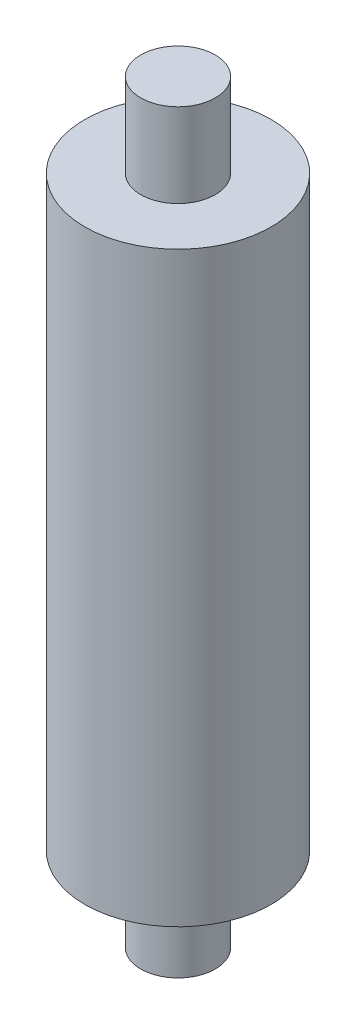
ISO-10303-21;
HEADER;
FILE_DESCRIPTION(('STEP AP214'),'2;1');
FILE_NAME('part.step','',(''),(''),'','','');
FILE_SCHEMA(('AUTOMOTIVE_DESIGN { 1 0 10303 214 1 1 1 1 }'));
ENDSEC;
DATA;
#1=APPLICATION_CONTEXT('core data for automotive mechanical design processes');
#2=APPLICATION_PROTOCOL_DEFINITION('international standard','automotive_design',2000,#1);
#3=PRODUCT_CONTEXT('',#1,'mechanical');
#4=PRODUCT('Part','Part','',(#3));
#5=PRODUCT_RELATED_PRODUCT_CATEGORY('part','',(#4));
#6=PRODUCT_DEFINITION_FORMATION('','',#4);
#7=PRODUCT_DEFINITION_CONTEXT('part definition',#1,'design');
#8=PRODUCT_DEFINITION('design','',#6,#7);
#9=PRODUCT_DEFINITION_SHAPE('','',#8);
#10=(LENGTH_UNIT() NAMED_UNIT(*) SI_UNIT(.MILLI.,.METRE.));
#11=(NAMED_UNIT(*) PLANE_ANGLE_UNIT() SI_UNIT($,.RADIAN.));
#12=(NAMED_UNIT(*) SI_UNIT($,.STERADIAN.) SOLID_ANGLE_UNIT());
#13=UNCERTAINTY_MEASURE_WITH_UNIT(LENGTH_MEASURE(1.E-05),#10,'distance_accuracy_value','');
#14=(GEOMETRIC_REPRESENTATION_CONTEXT(3) GLOBAL_UNCERTAINTY_ASSIGNED_CONTEXT((#13)) GLOBAL_UNIT_ASSIGNED_CONTEXT((#10,
#11,#12)) REPRESENTATION_CONTEXT('',''));
#15=CARTESIAN_POINT('',(0.,0.,0.));
#16=DIRECTION('',(0.,0.,1.));
#17=DIRECTION('',(1.,0.,0.));
#18=AXIS2_PLACEMENT_3D('',#15,#16,#17);
#19=CARTESIAN_POINT('',(0.,-40.5000000000002,0.));
#20=DIRECTION('',(0.,-1.,0.));
#21=DIRECTION('',(0.,0.,-1.));
#22=AXIS2_PLACEMENT_3D('',#19,#20,#21);
#23=PLANE('',#22);
#24=CARTESIAN_POINT('',(0.,-40.5000000000002,-1.38925084454874E-13));
#25=DIRECTION('',(0.,-1.,0.));
#26=DIRECTION('',(0.,0.,-1.));
#27=AXIS2_PLACEMENT_3D('',#24,#25,#26);
#28=CIRCLE('',#27,3.99999999999986);
#29=CARTESIAN_POINT('',(0.,-40.5000000000002,-4.));
#30=VERTEX_POINT('',#29);
#31=EDGE_CURVE('E10',#30,#30,#28,.T.);
#32=ORIENTED_EDGE('',*,*,#31,.T.);
#33=EDGE_LOOP('',(#32));
#34=FACE_BOUND('',#33,.T.);
#35=ADVANCED_FACE('F33',(#34),#23,.T.);
#36=CARTESIAN_POINT('',(0.,-1000.,-3.43024899888577E-12));
#37=DIRECTION('',(0.,-1.,0.));
#38=DIRECTION('',(0.,0.,-1.));
#39=AXIS2_PLACEMENT_3D('',#36,#37,#38);
#40=CYLINDRICAL_SURFACE('',#39,3.99999999999988);
#41=CARTESIAN_POINT('',(0.,-31.5000000000002,-1.08052843464902E-13));
#42=DIRECTION('',(0.,-1.,0.));
#43=DIRECTION('',(0.,0.,-1.));
#44=AXIS2_PLACEMENT_3D('',#41,#42,#43);
#45=CIRCLE('',#44,3.99999999999989);
#46=CARTESIAN_POINT('',(0.,-31.5000000000002,-4.));
#47=VERTEX_POINT('',#46);
#48=EDGE_CURVE('E39',#47,#47,#45,.T.);
#49=ORIENTED_EDGE('',*,*,#48,.T.);
#50=EDGE_LOOP('',(#49));
#51=FACE_BOUND('',#50,.T.);
#52=ORIENTED_EDGE('',*,*,#31,.F.);
#53=EDGE_LOOP('',(#52));
#54=FACE_BOUND('',#53,.T.);
#55=ADVANCED_FACE('F83',(#51,#54),#40,.T.);
#56=CARTESIAN_POINT('',(0.,-31.5000000000002,-4.));
#57=DIRECTION('',(0.,-1.,0.));
#58=DIRECTION('',(0.,0.,-1.));
#59=AXIS2_PLACEMENT_3D('',#56,#57,#58);
#60=PLANE('',#59);
#61=CARTESIAN_POINT('',(0.,-31.5000000000002,-1.08052843464902E-13));
#62=DIRECTION('',(0.,-1.,0.));
#63=DIRECTION('',(0.,0.,-1.));
#64=AXIS2_PLACEMENT_3D('',#61,#62,#63);
#65=CIRCLE('',#64,9.99999999999989);
#66=CARTESIAN_POINT('',(0.,-31.5000000000002,-10.));
#67=VERTEX_POINT('',#66);
#68=EDGE_CURVE('E43',#67,#67,#65,.T.);
#69=ORIENTED_EDGE('',*,*,#68,.T.);
#70=EDGE_LOOP('',(#69));
#71=FACE_BOUND('',#70,.T.);
#72=ORIENTED_EDGE('',*,*,#48,.F.);
#73=EDGE_LOOP('',(#72));
#74=FACE_BOUND('',#73,.T.);
#75=ADVANCED_FACE('F79',(#71,#74),#60,.T.);
#76=CARTESIAN_POINT('',(0.,-1000.,-3.43024899888577E-12));
#77=DIRECTION('',(0.,-1.,0.));
#78=DIRECTION('',(0.,0.,-1.));
#79=AXIS2_PLACEMENT_3D('',#76,#77,#78);
#80=CYLINDRICAL_SURFACE('',#79,9.99999999999994);
#81=ORIENTED_EDGE('',*,*,#68,.F.);
#82=EDGE_LOOP('',(#81));
#83=FACE_BOUND('',#82,.T.);
#84=CARTESIAN_POINT('',(0.,31.5000000000002,1.08052843464902E-13));
#85=DIRECTION('',(0.,-1.,0.));
#86=DIRECTION('',(0.,0.,-1.));
#87=AXIS2_PLACEMENT_3D('',#84,#85,#86);
#88=CIRCLE('',#87,9.99999999999989);
#89=CARTESIAN_POINT('',(0.,31.5000000000002,-9.99999999999979));
#90=VERTEX_POINT('',#89);
#91=EDGE_CURVE('E55',#90,#90,#88,.T.);
#92=ORIENTED_EDGE('',*,*,#91,.T.);
#93=EDGE_LOOP('',(#92));
#94=FACE_BOUND('',#93,.T.);
#95=ADVANCED_FACE('F59',(#83,#94),#80,.T.);
#96=CARTESIAN_POINT('',(0.,40.5000000000002,2.72890349373202E-13));
#97=DIRECTION('',(0.,1.,0.));
#98=DIRECTION('',(0.,0.,-1.));
#99=AXIS2_PLACEMENT_3D('',#96,#97,#98);
#100=PLANE('',#99);
#101=CARTESIAN_POINT('',(0.,40.5000000000002,1.38925084454874E-13));
#102=DIRECTION('',(0.,-1.,0.));
#103=DIRECTION('',(0.,0.,-1.));
#104=AXIS2_PLACEMENT_3D('',#101,#102,#103);
#105=CIRCLE('',#104,3.99999999999986);
#106=CARTESIAN_POINT('',(0.,40.5000000000002,-3.99999999999972));
#107=VERTEX_POINT('',#106);
#108=EDGE_CURVE('E47',#107,#107,#105,.T.);
#109=ORIENTED_EDGE('',*,*,#108,.F.);
#110=EDGE_LOOP('',(#109));
#111=FACE_BOUND('',#110,.T.);
#112=ADVANCED_FACE('F70',(#111),#100,.T.);
#113=CARTESIAN_POINT('',(0.,1000.,3.43024899888577E-12));
#114=DIRECTION('',(0.,1.,0.));
#115=DIRECTION('',(0.,0.,-1.));
#116=AXIS2_PLACEMENT_3D('',#113,#114,#115);
#117=CYLINDRICAL_SURFACE('',#116,3.99999999999988);
#118=CARTESIAN_POINT('',(0.,31.5000000000002,1.08052843464902E-13));
#119=DIRECTION('',(0.,-1.,0.));
#120=DIRECTION('',(0.,0.,-1.));
#121=AXIS2_PLACEMENT_3D('',#118,#119,#120);
#122=CIRCLE('',#121,3.99999999999989);
#123=CARTESIAN_POINT('',(0.,31.5000000000002,-3.99999999999978));
#124=VERTEX_POINT('',#123);
#125=EDGE_CURVE('E52',#124,#124,#122,.T.);
#126=ORIENTED_EDGE('',*,*,#125,.F.);
#127=EDGE_LOOP('',(#126));
#128=FACE_BOUND('',#127,.T.);
#129=ORIENTED_EDGE('',*,*,#108,.T.);
#130=EDGE_LOOP('',(#129));
#131=FACE_BOUND('',#130,.T.);
#132=ADVANCED_FACE('F64',(#128,#131),#117,.T.);
#133=CARTESIAN_POINT('',(0.,31.5000000000002,-3.99999999999978));
#134=DIRECTION('',(0.,1.,0.));
#135=DIRECTION('',(0.,0.,-1.));
#136=AXIS2_PLACEMENT_3D('',#133,#134,#135);
#137=PLANE('',#136);
#138=ORIENTED_EDGE('',*,*,#91,.F.);
#139=EDGE_LOOP('',(#138));
#140=FACE_BOUND('',#139,.T.);
#141=ORIENTED_EDGE('',*,*,#125,.T.);
#142=EDGE_LOOP('',(#141));
#143=FACE_BOUND('',#142,.T.);
#144=ADVANCED_FACE('F61',(#140,#143),#137,.T.);
#145=CLOSED_SHELL('',(#35,#55,#75,#95,#112,#132,#144));
#146=MANIFOLD_SOLID_BREP('B2',#145);
#147=ADVANCED_BREP_SHAPE_REPRESENTATION('',(#18,#146),#14);
#148=SHAPE_DEFINITION_REPRESENTATION(#9,#147);
ENDSEC;
END-ISO-10303-21;
